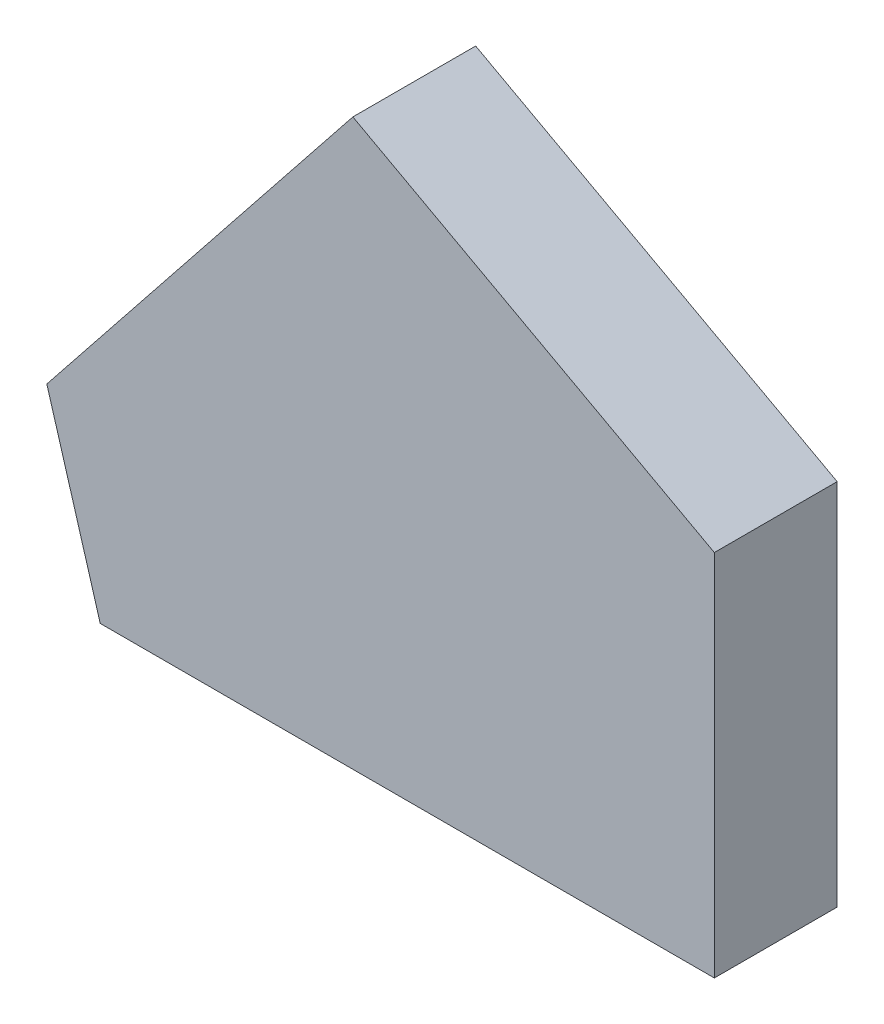
ISO-10303-21;
HEADER;
FILE_DESCRIPTION(('STEP AP214'),'2;1');
FILE_NAME('part.step','',(''),(''),'','','');
FILE_SCHEMA(('AUTOMOTIVE_DESIGN { 1 0 10303 214 1 1 1 1 }'));
ENDSEC;
DATA;
#1=APPLICATION_CONTEXT('core data for automotive mechanical design processes');
#2=APPLICATION_PROTOCOL_DEFINITION('international standard','automotive_design',2000,#1);
#3=PRODUCT_CONTEXT('',#1,'mechanical');
#4=PRODUCT('Part','Part','',(#3));
#5=PRODUCT_RELATED_PRODUCT_CATEGORY('part','',(#4));
#6=PRODUCT_DEFINITION_FORMATION('','',#4);
#7=PRODUCT_DEFINITION_CONTEXT('part definition',#1,'design');
#8=PRODUCT_DEFINITION('design','',#6,#7);
#9=PRODUCT_DEFINITION_SHAPE('','',#8);
#10=(LENGTH_UNIT() NAMED_UNIT(*) SI_UNIT(.MILLI.,.METRE.));
#11=(NAMED_UNIT(*) PLANE_ANGLE_UNIT() SI_UNIT($,.RADIAN.));
#12=(NAMED_UNIT(*) SI_UNIT($,.STERADIAN.) SOLID_ANGLE_UNIT());
#13=UNCERTAINTY_MEASURE_WITH_UNIT(LENGTH_MEASURE(1.E-05),#10,'distance_accuracy_value','');
#14=(GEOMETRIC_REPRESENTATION_CONTEXT(3) GLOBAL_UNCERTAINTY_ASSIGNED_CONTEXT((#13)) GLOBAL_UNIT_ASSIGNED_CONTEXT((#10,
#11,#12)) REPRESENTATION_CONTEXT('',''));
#15=CARTESIAN_POINT('',(0.,0.,0.));
#16=DIRECTION('',(0.,0.,1.));
#17=DIRECTION('',(1.,0.,0.));
#18=AXIS2_PLACEMENT_3D('',#15,#16,#17);
#19=CARTESIAN_POINT('',(0.,0.,10.));
#20=DIRECTION('',(1.,0.,0.));
#21=DIRECTION('',(0.,1.,0.));
#22=AXIS2_PLACEMENT_3D('',#19,#20,#21);
#23=PLANE('',#22);
#24=DIRECTION('',(0.,-1.,0.));
#25=VECTOR('',#24,1.);
#26=CARTESIAN_POINT('',(0.,0.,0.));
#27=LINE('',#26,#25);
#28=CARTESIAN_POINT('',(0.,30.,0.));
#29=VERTEX_POINT('',#28);
#30=CARTESIAN_POINT('',(0.,0.,0.));
#31=VERTEX_POINT('',#30);
#32=EDGE_CURVE('E139',#29,#31,#27,.T.);
#33=ORIENTED_EDGE('',*,*,#32,.F.);
#34=DIRECTION('',(0.,0.,-1.));
#35=VECTOR('',#34,1.);
#36=CARTESIAN_POINT('',(0.,30.,10.));
#37=LINE('',#36,#35);
#38=CARTESIAN_POINT('',(0.,30.,10.));
#39=VERTEX_POINT('',#38);
#40=EDGE_CURVE('E12',#39,#29,#37,.T.);
#41=ORIENTED_EDGE('',*,*,#40,.F.);
#42=DIRECTION('',(0.,-1.,0.));
#43=VECTOR('',#42,1.);
#44=CARTESIAN_POINT('',(0.,0.,10.));
#45=LINE('',#44,#43);
#46=CARTESIAN_POINT('',(0.,0.,10.));
#47=VERTEX_POINT('',#46);
#48=EDGE_CURVE('E150',#39,#47,#45,.T.);
#49=ORIENTED_EDGE('',*,*,#48,.T.);
#50=DIRECTION('',(0.,0.,-1.));
#51=VECTOR('',#50,1.);
#52=CARTESIAN_POINT('',(0.,0.,10.));
#53=LINE('',#52,#51);
#54=EDGE_CURVE('E82',#47,#31,#53,.T.);
#55=ORIENTED_EDGE('',*,*,#54,.T.);
#56=EDGE_LOOP('',(#33,#41,#49,#55));
#57=FACE_BOUND('',#56,.T.);
#58=ADVANCED_FACE('F66',(#57),#23,.T.);
#59=CARTESIAN_POINT('',(0.,0.,0.));
#60=DIRECTION('',(0.,0.,1.));
#61=DIRECTION('',(1.,0.,0.));
#62=AXIS2_PLACEMENT_3D('',#59,#60,#61);
#63=PLANE('',#62);
#64=ORIENTED_EDGE('',*,*,#32,.T.);
#65=DIRECTION('',(-1.,0.,0.));
#66=VECTOR('',#65,1.);
#67=CARTESIAN_POINT('',(0.,0.,0.));
#68=LINE('',#67,#66);
#69=CARTESIAN_POINT('',(-50.,0.,0.));
#70=VERTEX_POINT('',#69);
#71=EDGE_CURVE('E147',#31,#70,#68,.T.);
#72=ORIENTED_EDGE('',*,*,#71,.T.);
#73=DIRECTION('',(-0.283513173680293,0.958968341682731,0.));
#74=VECTOR('',#73,1.);
#75=CARTESIAN_POINT('',(-45.9810140174864,-13.5940079004699,0.));
#76=LINE('',#75,#74);
#77=CARTESIAN_POINT('',(-54.348543382899,14.708718408043,0.));
#78=VERTEX_POINT('',#77);
#79=EDGE_CURVE('E145',#70,#78,#76,.T.);
#80=ORIENTED_EDGE('',*,*,#79,.T.);
#81=DIRECTION('',(0.622924401679718,0.782282039798924,0.));
#82=VECTOR('',#81,1.);
#83=CARTESIAN_POINT('',(-40.4270129712142,32.1916797083374,0.));
#84=LINE('',#83,#82);
#85=CARTESIAN_POINT('',(-29.4315673157102,46.,0.));
#86=VERTEX_POINT('',#85);
#87=EDGE_CURVE('E119',#78,#86,#84,.T.);
#88=ORIENTED_EDGE('',*,*,#87,.T.);
#89=DIRECTION('',(0.87856710501213,-0.477618929682028,0.));
#90=VECTOR('',#89,1.);
#91=CARTESIAN_POINT('',(12.5886084104919,23.1564047402818,0.));
#92=LINE('',#91,#90);
#93=EDGE_CURVE('E141',#86,#29,#92,.T.);
#94=ORIENTED_EDGE('',*,*,#93,.T.);
#95=EDGE_LOOP('',(#64,#72,#80,#88,#94));
#96=FACE_BOUND('',#95,.T.);
#97=ADVANCED_FACE('F156',(#96),#63,.F.);
#98=CARTESIAN_POINT('',(0.,0.,10.));
#99=DIRECTION('',(0.,-1.,0.));
#100=DIRECTION('',(0.,0.,-1.));
#101=AXIS2_PLACEMENT_3D('',#98,#99,#100);
#102=PLANE('',#101);
#103=ORIENTED_EDGE('',*,*,#71,.F.);
#104=ORIENTED_EDGE('',*,*,#54,.F.);
#105=DIRECTION('',(-1.,0.,0.));
#106=VECTOR('',#105,1.);
#107=CARTESIAN_POINT('',(0.,0.,10.));
#108=LINE('',#107,#106);
#109=CARTESIAN_POINT('',(-50.,0.,10.));
#110=VERTEX_POINT('',#109);
#111=EDGE_CURVE('E134',#47,#110,#108,.T.);
#112=ORIENTED_EDGE('',*,*,#111,.T.);
#113=DIRECTION('',(0.,0.,-1.));
#114=VECTOR('',#113,1.);
#115=CARTESIAN_POINT('',(-50.,0.,10.));
#116=LINE('',#115,#114);
#117=EDGE_CURVE('E98',#110,#70,#116,.T.);
#118=ORIENTED_EDGE('',*,*,#117,.T.);
#119=EDGE_LOOP('',(#103,#104,#112,#118));
#120=FACE_BOUND('',#119,.T.);
#121=ADVANCED_FACE('F157',(#120),#102,.T.);
#122=CARTESIAN_POINT('',(-45.9810140174864,-13.5940079004699,10.));
#123=DIRECTION('',(-0.958968341682732,-0.283513173680293,0.));
#124=DIRECTION('',(0.283513173680293,-0.958968341682732,0.));
#125=AXIS2_PLACEMENT_3D('',#122,#123,#124);
#126=PLANE('',#125);
#127=ORIENTED_EDGE('',*,*,#79,.F.);
#128=ORIENTED_EDGE('',*,*,#117,.F.);
#129=DIRECTION('',(-0.283513173680293,0.958968341682731,0.));
#130=VECTOR('',#129,1.);
#131=CARTESIAN_POINT('',(-45.9810140174864,-13.5940079004699,10.));
#132=LINE('',#131,#130);
#133=CARTESIAN_POINT('',(-54.348543382899,14.708718408043,10.));
#134=VERTEX_POINT('',#133);
#135=EDGE_CURVE('E129',#110,#134,#132,.T.);
#136=ORIENTED_EDGE('',*,*,#135,.T.);
#137=DIRECTION('',(0.,0.,-1.));
#138=VECTOR('',#137,1.);
#139=CARTESIAN_POINT('',(-54.348543382899,14.708718408043,10.));
#140=LINE('',#139,#138);
#141=EDGE_CURVE('E114',#134,#78,#140,.T.);
#142=ORIENTED_EDGE('',*,*,#141,.T.);
#143=EDGE_LOOP('',(#127,#128,#136,#142));
#144=FACE_BOUND('',#143,.T.);
#145=ADVANCED_FACE('F133',(#144),#126,.T.);
#146=CARTESIAN_POINT('',(-40.4270129712142,32.1916797083374,10.));
#147=DIRECTION('',(-0.782282039798924,0.622924401679718,0.));
#148=DIRECTION('',(-0.622924401679718,-0.782282039798924,0.));
#149=AXIS2_PLACEMENT_3D('',#146,#147,#148);
#150=PLANE('',#149);
#151=ORIENTED_EDGE('',*,*,#87,.F.);
#152=ORIENTED_EDGE('',*,*,#141,.F.);
#153=DIRECTION('',(0.622924401679718,0.782282039798924,0.));
#154=VECTOR('',#153,1.);
#155=CARTESIAN_POINT('',(-40.4270129712142,32.1916797083374,10.));
#156=LINE('',#155,#154);
#157=CARTESIAN_POINT('',(-29.4315673157102,46.,10.));
#158=VERTEX_POINT('',#157);
#159=EDGE_CURVE('E117',#134,#158,#156,.T.);
#160=ORIENTED_EDGE('',*,*,#159,.T.);
#161=DIRECTION('',(0.,0.,-1.));
#162=VECTOR('',#161,1.);
#163=CARTESIAN_POINT('',(-29.4315673157102,46.,10.));
#164=LINE('',#163,#162);
#165=EDGE_CURVE('E74',#158,#86,#164,.T.);
#166=ORIENTED_EDGE('',*,*,#165,.T.);
#167=EDGE_LOOP('',(#151,#152,#160,#166));
#168=FACE_BOUND('',#167,.T.);
#169=ADVANCED_FACE('F116',(#168),#150,.T.);
#170=CARTESIAN_POINT('',(12.5886084104919,23.1564047402818,10.));
#171=DIRECTION('',(0.477618929682028,0.87856710501213,0.));
#172=DIRECTION('',(-0.87856710501213,0.477618929682028,0.));
#173=AXIS2_PLACEMENT_3D('',#170,#171,#172);
#174=PLANE('',#173);
#175=ORIENTED_EDGE('',*,*,#93,.F.);
#176=ORIENTED_EDGE('',*,*,#165,.F.);
#177=DIRECTION('',(0.87856710501213,-0.477618929682028,0.));
#178=VECTOR('',#177,1.);
#179=CARTESIAN_POINT('',(12.5886084104919,23.1564047402818,10.));
#180=LINE('',#179,#178);
#181=EDGE_CURVE('E131',#158,#39,#180,.T.);
#182=ORIENTED_EDGE('',*,*,#181,.T.);
#183=ORIENTED_EDGE('',*,*,#40,.T.);
#184=EDGE_LOOP('',(#175,#176,#182,#183));
#185=FACE_BOUND('',#184,.T.);
#186=ADVANCED_FACE('F154',(#185),#174,.T.);
#187=CARTESIAN_POINT('',(0.,0.,10.));
#188=DIRECTION('',(0.,0.,1.));
#189=DIRECTION('',(1.,0.,0.));
#190=AXIS2_PLACEMENT_3D('',#187,#188,#189);
#191=PLANE('',#190);
#192=ORIENTED_EDGE('',*,*,#48,.F.);
#193=ORIENTED_EDGE('',*,*,#181,.F.);
#194=ORIENTED_EDGE('',*,*,#159,.F.);
#195=ORIENTED_EDGE('',*,*,#135,.F.);
#196=ORIENTED_EDGE('',*,*,#111,.F.);
#197=EDGE_LOOP('',(#192,#193,#194,#195,#196));
#198=FACE_BOUND('',#197,.T.);
#199=ADVANCED_FACE('F127',(#198),#191,.T.);
#200=CLOSED_SHELL('',(#58,#97,#121,#145,#169,#186,#199));
#201=MANIFOLD_SOLID_BREP('B2',#200);
#202=ADVANCED_BREP_SHAPE_REPRESENTATION('',(#18,#201),#14);
#203=SHAPE_DEFINITION_REPRESENTATION(#9,#202);
ENDSEC;
END-ISO-10303-21;
